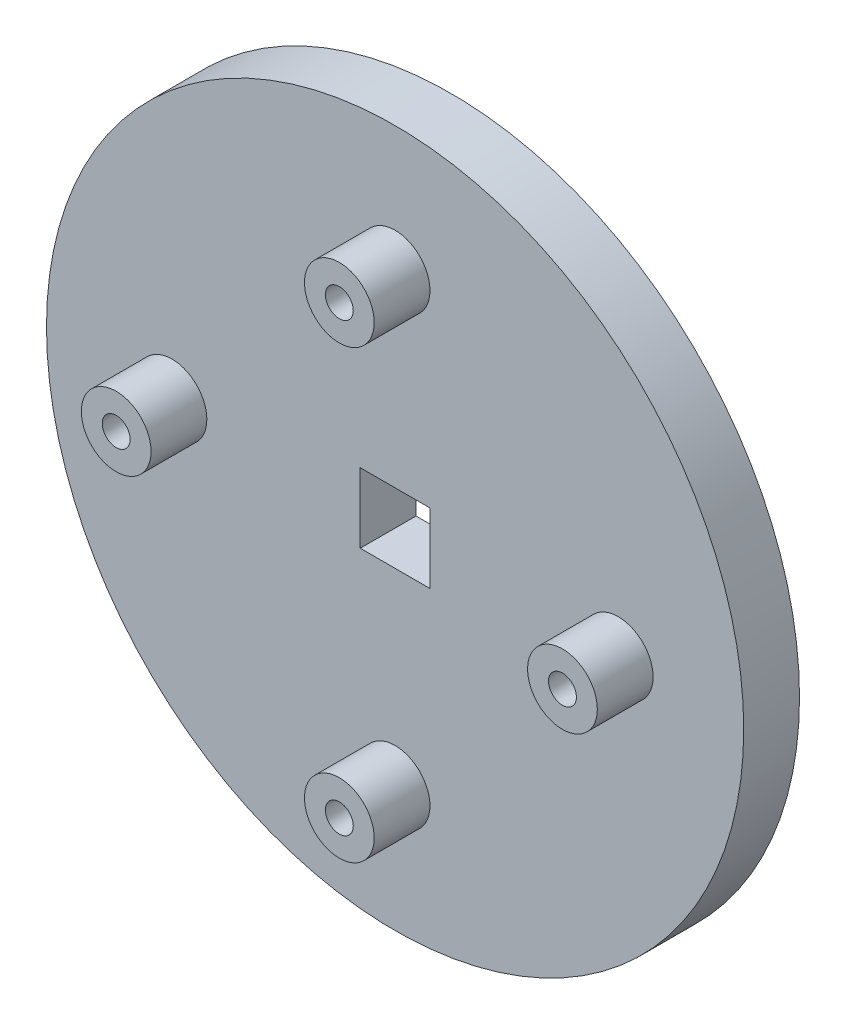
ISO-10303-21;
HEADER;
FILE_DESCRIPTION(('STEP AP214'),'2;1');
FILE_NAME('part.step','',(''),(''),'','','');
FILE_SCHEMA(('AUTOMOTIVE_DESIGN { 1 0 10303 214 1 1 1 1 }'));
ENDSEC;
DATA;
#1=APPLICATION_CONTEXT('core data for automotive mechanical design processes');
#2=APPLICATION_PROTOCOL_DEFINITION('international standard','automotive_design',2000,#1);
#3=PRODUCT_CONTEXT('',#1,'mechanical');
#4=PRODUCT('Part','Part','',(#3));
#5=PRODUCT_RELATED_PRODUCT_CATEGORY('part','',(#4));
#6=PRODUCT_DEFINITION_FORMATION('','',#4);
#7=PRODUCT_DEFINITION_CONTEXT('part definition',#1,'design');
#8=PRODUCT_DEFINITION('design','',#6,#7);
#9=PRODUCT_DEFINITION_SHAPE('','',#8);
#10=(LENGTH_UNIT() NAMED_UNIT(*) SI_UNIT(.MILLI.,.METRE.));
#11=(NAMED_UNIT(*) PLANE_ANGLE_UNIT() SI_UNIT($,.RADIAN.));
#12=(NAMED_UNIT(*) SI_UNIT($,.STERADIAN.) SOLID_ANGLE_UNIT());
#13=UNCERTAINTY_MEASURE_WITH_UNIT(LENGTH_MEASURE(1.E-05),#10,'distance_accuracy_value','');
#14=(GEOMETRIC_REPRESENTATION_CONTEXT(3) GLOBAL_UNCERTAINTY_ASSIGNED_CONTEXT((#13)) GLOBAL_UNIT_ASSIGNED_CONTEXT((#10,
#11,#12)) REPRESENTATION_CONTEXT('',''));
#15=CARTESIAN_POINT('',(0.,0.,0.));
#16=DIRECTION('',(0.,0.,1.));
#17=DIRECTION('',(1.,0.,0.));
#18=AXIS2_PLACEMENT_3D('',#15,#16,#17);
#19=CARTESIAN_POINT('',(0.,0.,8.));
#20=DIRECTION('',(0.,0.,-1.));
#21=DIRECTION('',(-1.,0.,0.));
#22=AXIS2_PLACEMENT_3D('',#19,#20,#21);
#23=CYLINDRICAL_SURFACE('',#22,50.);
#24=CARTESIAN_POINT('',(0.,0.,8.));
#25=DIRECTION('',(0.,0.,1.));
#26=DIRECTION('',(1.,0.,0.));
#27=AXIS2_PLACEMENT_3D('',#24,#25,#26);
#28=CIRCLE('',#27,50.);
#29=CARTESIAN_POINT('',(50.,0.,8.));
#30=VERTEX_POINT('',#29);
#31=EDGE_CURVE('E122',#30,#30,#28,.T.);
#32=ORIENTED_EDGE('',*,*,#31,.F.);
#33=EDGE_LOOP('',(#32));
#34=FACE_BOUND('',#33,.T.);
#35=CARTESIAN_POINT('',(0.,0.,0.));
#36=DIRECTION('',(0.,0.,1.));
#37=DIRECTION('',(1.,0.,0.));
#38=AXIS2_PLACEMENT_3D('',#35,#36,#37);
#39=CIRCLE('',#38,50.);
#40=CARTESIAN_POINT('',(50.,0.,0.));
#41=VERTEX_POINT('',#40);
#42=EDGE_CURVE('E118',#41,#41,#39,.T.);
#43=ORIENTED_EDGE('',*,*,#42,.T.);
#44=EDGE_LOOP('',(#43));
#45=FACE_BOUND('',#44,.T.);
#46=ADVANCED_FACE('F41',(#34,#45),#23,.T.);
#47=CARTESIAN_POINT('',(0.,0.,8.));
#48=DIRECTION('',(0.,0.,1.));
#49=DIRECTION('',(1.,0.,0.));
#50=AXIS2_PLACEMENT_3D('',#47,#48,#49);
#51=PLANE('',#50);
#52=CARTESIAN_POINT('',(0.,32.,8.));
#53=DIRECTION('',(0.,0.,1.));
#54=DIRECTION('',(1.,0.,0.));
#55=AXIS2_PLACEMENT_3D('',#52,#53,#54);
#56=CIRCLE('',#55,5.);
#57=CARTESIAN_POINT('',(5.,32.,8.));
#58=VERTEX_POINT('',#57);
#59=EDGE_CURVE('E231',#58,#58,#56,.T.);
#60=ORIENTED_EDGE('',*,*,#59,.F.);
#61=EDGE_LOOP('',(#60));
#62=FACE_BOUND('',#61,.T.);
#63=CARTESIAN_POINT('',(-32.,3.35182208528941E-13,8.));
#64=DIRECTION('',(0.,0.,1.));
#65=DIRECTION('',(1.,0.,0.));
#66=AXIS2_PLACEMENT_3D('',#63,#64,#65);
#67=CIRCLE('',#66,5.);
#68=CARTESIAN_POINT('',(-27.,3.35182208528941E-13,8.));
#69=VERTEX_POINT('',#68);
#70=EDGE_CURVE('E240',#69,#69,#67,.T.);
#71=ORIENTED_EDGE('',*,*,#70,.F.);
#72=EDGE_LOOP('',(#71));
#73=FACE_BOUND('',#72,.T.);
#74=CARTESIAN_POINT('',(32.,-1.1172740284298E-13,8.));
#75=DIRECTION('',(0.,0.,1.));
#76=DIRECTION('',(1.,0.,0.));
#77=AXIS2_PLACEMENT_3D('',#74,#75,#76);
#78=CIRCLE('',#77,5.);
#79=CARTESIAN_POINT('',(37.,-1.1172740284298E-13,8.));
#80=VERTEX_POINT('',#79);
#81=EDGE_CURVE('E249',#80,#80,#78,.T.);
#82=ORIENTED_EDGE('',*,*,#81,.F.);
#83=EDGE_LOOP('',(#82));
#84=FACE_BOUND('',#83,.T.);
#85=CARTESIAN_POINT('',(-2.23454805685961E-13,-32.,8.));
#86=DIRECTION('',(0.,0.,1.));
#87=DIRECTION('',(1.,0.,0.));
#88=AXIS2_PLACEMENT_3D('',#85,#86,#87);
#89=CIRCLE('',#88,5.);
#90=CARTESIAN_POINT('',(4.99999999999977,-32.,8.));
#91=VERTEX_POINT('',#90);
#92=EDGE_CURVE('E105',#91,#91,#89,.T.);
#93=ORIENTED_EDGE('',*,*,#92,.F.);
#94=EDGE_LOOP('',(#93));
#95=FACE_BOUND('',#94,.T.);
#96=DIRECTION('',(0.,1.,0.));
#97=VECTOR('',#96,1.);
#98=CARTESIAN_POINT('',(5.,-5.,8.));
#99=LINE('',#98,#97);
#100=CARTESIAN_POINT('',(5.,-5.,8.));
#101=VERTEX_POINT('',#100);
#102=CARTESIAN_POINT('',(5.,5.,8.));
#103=VERTEX_POINT('',#102);
#104=EDGE_CURVE('E55',#101,#103,#99,.T.);
#105=ORIENTED_EDGE('',*,*,#104,.F.);
#106=DIRECTION('',(1.,0.,0.));
#107=VECTOR('',#106,1.);
#108=CARTESIAN_POINT('',(-5.,-5.,8.));
#109=LINE('',#108,#107);
#110=CARTESIAN_POINT('',(-5.,-5.,8.));
#111=VERTEX_POINT('',#110);
#112=EDGE_CURVE('E99',#111,#101,#109,.T.);
#113=ORIENTED_EDGE('',*,*,#112,.F.);
#114=DIRECTION('',(0.,-1.,0.));
#115=VECTOR('',#114,1.);
#116=CARTESIAN_POINT('',(-5.,-5.,8.));
#117=LINE('',#116,#115);
#118=CARTESIAN_POINT('',(-5.,5.,8.));
#119=VERTEX_POINT('',#118);
#120=EDGE_CURVE('E102',#119,#111,#117,.T.);
#121=ORIENTED_EDGE('',*,*,#120,.F.);
#122=DIRECTION('',(-1.,0.,0.));
#123=VECTOR('',#122,1.);
#124=CARTESIAN_POINT('',(-5.,5.,8.));
#125=LINE('',#124,#123);
#126=EDGE_CURVE('E111',#103,#119,#125,.T.);
#127=ORIENTED_EDGE('',*,*,#126,.F.);
#128=EDGE_LOOP('',(#105,#113,#121,#127));
#129=FACE_BOUND('',#128,.T.);
#130=ORIENTED_EDGE('',*,*,#31,.T.);
#131=EDGE_LOOP('',(#130));
#132=FACE_BOUND('',#131,.T.);
#133=ADVANCED_FACE('F154',(#62,#73,#84,#95,#129,#132),#51,.T.);
#134=CARTESIAN_POINT('',(0.,0.,0.));
#135=DIRECTION('',(0.,0.,1.));
#136=DIRECTION('',(1.,0.,0.));
#137=AXIS2_PLACEMENT_3D('',#134,#135,#136);
#138=PLANE('',#137);
#139=DIRECTION('',(1.,0.,0.));
#140=VECTOR('',#139,1.);
#141=CARTESIAN_POINT('',(-5.,-5.,0.));
#142=LINE('',#141,#140);
#143=CARTESIAN_POINT('',(-5.,-5.,0.));
#144=VERTEX_POINT('',#143);
#145=CARTESIAN_POINT('',(5.,-5.,0.));
#146=VERTEX_POINT('',#145);
#147=EDGE_CURVE('E89',#144,#146,#142,.T.);
#148=ORIENTED_EDGE('',*,*,#147,.T.);
#149=DIRECTION('',(0.,1.,0.));
#150=VECTOR('',#149,1.);
#151=CARTESIAN_POINT('',(5.,-5.,0.));
#152=LINE('',#151,#150);
#153=CARTESIAN_POINT('',(5.,5.,0.));
#154=VERTEX_POINT('',#153);
#155=EDGE_CURVE('E83',#146,#154,#152,.T.);
#156=ORIENTED_EDGE('',*,*,#155,.T.);
#157=DIRECTION('',(-1.,0.,0.));
#158=VECTOR('',#157,1.);
#159=CARTESIAN_POINT('',(-5.,5.,0.));
#160=LINE('',#159,#158);
#161=CARTESIAN_POINT('',(-5.,5.,0.));
#162=VERTEX_POINT('',#161);
#163=EDGE_CURVE('E92',#154,#162,#160,.T.);
#164=ORIENTED_EDGE('',*,*,#163,.T.);
#165=DIRECTION('',(0.,-1.,0.));
#166=VECTOR('',#165,1.);
#167=CARTESIAN_POINT('',(-5.,-5.,0.));
#168=LINE('',#167,#166);
#169=EDGE_CURVE('E63',#162,#144,#168,.T.);
#170=ORIENTED_EDGE('',*,*,#169,.T.);
#171=EDGE_LOOP('',(#148,#156,#164,#170));
#172=FACE_BOUND('',#171,.T.);
#173=ORIENTED_EDGE('',*,*,#42,.F.);
#174=EDGE_LOOP('',(#173));
#175=FACE_BOUND('',#174,.T.);
#176=ADVANCED_FACE('F96',(#172,#175),#138,.F.);
#177=CARTESIAN_POINT('',(5.,-5.,0.));
#178=DIRECTION('',(1.,0.,0.));
#179=DIRECTION('',(0.,0.,-1.));
#180=AXIS2_PLACEMENT_3D('',#177,#178,#179);
#181=PLANE('',#180);
#182=ORIENTED_EDGE('',*,*,#104,.T.);
#183=DIRECTION('',(0.,0.,1.));
#184=VECTOR('',#183,1.);
#185=CARTESIAN_POINT('',(5.,5.,0.));
#186=LINE('',#185,#184);
#187=EDGE_CURVE('E79',#154,#103,#186,.T.);
#188=ORIENTED_EDGE('',*,*,#187,.F.);
#189=ORIENTED_EDGE('',*,*,#155,.F.);
#190=DIRECTION('',(0.,0.,1.));
#191=VECTOR('',#190,1.);
#192=CARTESIAN_POINT('',(5.,-5.,0.));
#193=LINE('',#192,#191);
#194=EDGE_CURVE('E116',#146,#101,#193,.T.);
#195=ORIENTED_EDGE('',*,*,#194,.T.);
#196=EDGE_LOOP('',(#182,#188,#189,#195));
#197=FACE_BOUND('',#196,.T.);
#198=ADVANCED_FACE('F81',(#197),#181,.F.);
#199=CARTESIAN_POINT('',(-5.,-5.,0.));
#200=DIRECTION('',(0.,-1.,0.));
#201=DIRECTION('',(0.,0.,-1.));
#202=AXIS2_PLACEMENT_3D('',#199,#200,#201);
#203=PLANE('',#202);
#204=ORIENTED_EDGE('',*,*,#112,.T.);
#205=ORIENTED_EDGE('',*,*,#194,.F.);
#206=ORIENTED_EDGE('',*,*,#147,.F.);
#207=DIRECTION('',(0.,0.,1.));
#208=VECTOR('',#207,1.);
#209=CARTESIAN_POINT('',(-5.,-5.,0.));
#210=LINE('',#209,#208);
#211=EDGE_CURVE('E119',#144,#111,#210,.T.);
#212=ORIENTED_EDGE('',*,*,#211,.T.);
#213=EDGE_LOOP('',(#204,#205,#206,#212));
#214=FACE_BOUND('',#213,.T.);
#215=ADVANCED_FACE('F176',(#214),#203,.F.);
#216=CARTESIAN_POINT('',(-5.,-5.,0.));
#217=DIRECTION('',(-1.,0.,0.));
#218=DIRECTION('',(0.,0.,1.));
#219=AXIS2_PLACEMENT_3D('',#216,#217,#218);
#220=PLANE('',#219);
#221=ORIENTED_EDGE('',*,*,#120,.T.);
#222=ORIENTED_EDGE('',*,*,#211,.F.);
#223=ORIENTED_EDGE('',*,*,#169,.F.);
#224=DIRECTION('',(0.,0.,1.));
#225=VECTOR('',#224,1.);
#226=CARTESIAN_POINT('',(-5.,5.,0.));
#227=LINE('',#226,#225);
#228=EDGE_CURVE('E88',#162,#119,#227,.T.);
#229=ORIENTED_EDGE('',*,*,#228,.T.);
#230=EDGE_LOOP('',(#221,#222,#223,#229));
#231=FACE_BOUND('',#230,.T.);
#232=ADVANCED_FACE('F180',(#231),#220,.F.);
#233=CARTESIAN_POINT('',(-5.,5.,0.));
#234=DIRECTION('',(0.,1.,0.));
#235=DIRECTION('',(0.,0.,1.));
#236=AXIS2_PLACEMENT_3D('',#233,#234,#235);
#237=PLANE('',#236);
#238=ORIENTED_EDGE('',*,*,#126,.T.);
#239=ORIENTED_EDGE('',*,*,#228,.F.);
#240=ORIENTED_EDGE('',*,*,#163,.F.);
#241=ORIENTED_EDGE('',*,*,#187,.T.);
#242=EDGE_LOOP('',(#238,#239,#240,#241));
#243=FACE_BOUND('',#242,.T.);
#244=ADVANCED_FACE('F93',(#243),#237,.F.);
#245=CARTESIAN_POINT('',(-2.23454805685961E-13,-32.,16.));
#246=DIRECTION('',(0.,0.,-1.));
#247=DIRECTION('',(-1.,0.,0.));
#248=AXIS2_PLACEMENT_3D('',#245,#246,#247);
#249=CYLINDRICAL_SURFACE('',#248,5.);
#250=CARTESIAN_POINT('',(-2.23454805685961E-13,-32.,16.));
#251=DIRECTION('',(0.,0.,1.));
#252=DIRECTION('',(1.,0.,0.));
#253=AXIS2_PLACEMENT_3D('',#250,#251,#252);
#254=CIRCLE('',#253,5.);
#255=CARTESIAN_POINT('',(4.99999999999977,-32.,16.));
#256=VERTEX_POINT('',#255);
#257=EDGE_CURVE('E255',#256,#256,#254,.T.);
#258=ORIENTED_EDGE('',*,*,#257,.F.);
#259=EDGE_LOOP('',(#258));
#260=FACE_BOUND('',#259,.T.);
#261=ORIENTED_EDGE('',*,*,#92,.T.);
#262=EDGE_LOOP('',(#261));
#263=FACE_BOUND('',#262,.T.);
#264=ADVANCED_FACE('F186',(#260,#263),#249,.T.);
#265=CARTESIAN_POINT('',(-2.23454805685961E-13,-32.,16.));
#266=DIRECTION('',(0.,0.,-1.));
#267=DIRECTION('',(-1.,0.,0.));
#268=AXIS2_PLACEMENT_3D('',#265,#266,#267);
#269=CYLINDRICAL_SURFACE('',#268,2.);
#270=CARTESIAN_POINT('',(-2.23454805685961E-13,-32.,16.));
#271=DIRECTION('',(0.,0.,1.));
#272=DIRECTION('',(1.,0.,0.));
#273=AXIS2_PLACEMENT_3D('',#270,#271,#272);
#274=CIRCLE('',#273,2.);
#275=CARTESIAN_POINT('',(1.99999999999978,-32.,16.));
#276=VERTEX_POINT('',#275);
#277=EDGE_CURVE('E254',#276,#276,#274,.T.);
#278=ORIENTED_EDGE('',*,*,#277,.T.);
#279=EDGE_LOOP('',(#278));
#280=FACE_BOUND('',#279,.T.);
#281=CARTESIAN_POINT('',(-2.23454805685961E-13,-32.,8.));
#282=DIRECTION('',(0.,0.,1.));
#283=DIRECTION('',(1.,0.,0.));
#284=AXIS2_PLACEMENT_3D('',#281,#282,#283);
#285=CIRCLE('',#284,2.);
#286=CARTESIAN_POINT('',(1.99999999999978,-32.,8.));
#287=VERTEX_POINT('',#286);
#288=EDGE_CURVE('E125',#287,#287,#285,.F.);
#289=ORIENTED_EDGE('',*,*,#288,.T.);
#290=EDGE_LOOP('',(#289));
#291=FACE_BOUND('',#290,.T.);
#292=ADVANCED_FACE('F191',(#280,#291),#269,.F.);
#293=CARTESIAN_POINT('',(0.,0.,16.));
#294=DIRECTION('',(0.,0.,1.));
#295=DIRECTION('',(1.,0.,0.));
#296=AXIS2_PLACEMENT_3D('',#293,#294,#295);
#297=PLANE('',#296);
#298=ORIENTED_EDGE('',*,*,#257,.T.);
#299=EDGE_LOOP('',(#298));
#300=FACE_BOUND('',#299,.T.);
#301=ORIENTED_EDGE('',*,*,#277,.F.);
#302=EDGE_LOOP('',(#301));
#303=FACE_BOUND('',#302,.T.);
#304=ADVANCED_FACE('F195',(#300,#303),#297,.T.);
#305=ORIENTED_EDGE('',*,*,#288,.F.);
#306=EDGE_LOOP('',(#305));
#307=FACE_BOUND('',#306,.T.);
#308=ADVANCED_FACE('F159',(#307),#51,.T.);
#309=CARTESIAN_POINT('',(32.,-1.1172740284298E-13,16.));
#310=DIRECTION('',(0.,0.,-1.));
#311=DIRECTION('',(-1.,0.,0.));
#312=AXIS2_PLACEMENT_3D('',#309,#310,#311);
#313=CYLINDRICAL_SURFACE('',#312,5.);
#314=CARTESIAN_POINT('',(32.,-1.1172740284298E-13,16.));
#315=DIRECTION('',(0.,0.,1.));
#316=DIRECTION('',(1.,0.,0.));
#317=AXIS2_PLACEMENT_3D('',#314,#315,#316);
#318=CIRCLE('',#317,5.);
#319=CARTESIAN_POINT('',(37.,-1.1172740284298E-13,16.));
#320=VERTEX_POINT('',#319);
#321=EDGE_CURVE('E246',#320,#320,#318,.T.);
#322=ORIENTED_EDGE('',*,*,#321,.F.);
#323=EDGE_LOOP('',(#322));
#324=FACE_BOUND('',#323,.T.);
#325=ORIENTED_EDGE('',*,*,#81,.T.);
#326=EDGE_LOOP('',(#325));
#327=FACE_BOUND('',#326,.T.);
#328=ADVANCED_FACE('F200',(#324,#327),#313,.T.);
#329=CARTESIAN_POINT('',(32.,-1.1172740284298E-13,16.));
#330=DIRECTION('',(0.,0.,-1.));
#331=DIRECTION('',(-1.,0.,0.));
#332=AXIS2_PLACEMENT_3D('',#329,#330,#331);
#333=CYLINDRICAL_SURFACE('',#332,2.);
#334=CARTESIAN_POINT('',(32.,-1.1172740284298E-13,16.));
#335=DIRECTION('',(0.,0.,1.));
#336=DIRECTION('',(1.,0.,0.));
#337=AXIS2_PLACEMENT_3D('',#334,#335,#336);
#338=CIRCLE('',#337,2.);
#339=CARTESIAN_POINT('',(34.,-1.1172740284298E-13,16.));
#340=VERTEX_POINT('',#339);
#341=EDGE_CURVE('E245',#340,#340,#338,.T.);
#342=ORIENTED_EDGE('',*,*,#341,.T.);
#343=EDGE_LOOP('',(#342));
#344=FACE_BOUND('',#343,.T.);
#345=CARTESIAN_POINT('',(32.,-1.1172740284298E-13,8.));
#346=DIRECTION('',(0.,0.,1.));
#347=DIRECTION('',(1.,0.,0.));
#348=AXIS2_PLACEMENT_3D('',#345,#346,#347);
#349=CIRCLE('',#348,2.);
#350=CARTESIAN_POINT('',(34.,-1.1172740284298E-13,8.));
#351=VERTEX_POINT('',#350);
#352=EDGE_CURVE('E130',#351,#351,#349,.F.);
#353=ORIENTED_EDGE('',*,*,#352,.T.);
#354=EDGE_LOOP('',(#353));
#355=FACE_BOUND('',#354,.T.);
#356=ADVANCED_FACE('F203',(#344,#355),#333,.F.);
#357=CARTESIAN_POINT('',(0.,0.,16.));
#358=DIRECTION('',(0.,0.,1.));
#359=DIRECTION('',(1.,0.,0.));
#360=AXIS2_PLACEMENT_3D('',#357,#358,#359);
#361=PLANE('',#360);
#362=ORIENTED_EDGE('',*,*,#321,.T.);
#363=EDGE_LOOP('',(#362));
#364=FACE_BOUND('',#363,.T.);
#365=ORIENTED_EDGE('',*,*,#341,.F.);
#366=EDGE_LOOP('',(#365));
#367=FACE_BOUND('',#366,.T.);
#368=ADVANCED_FACE('F157',(#364,#367),#361,.T.);
#369=ORIENTED_EDGE('',*,*,#352,.F.);
#370=EDGE_LOOP('',(#369));
#371=FACE_BOUND('',#370,.T.);
#372=ADVANCED_FACE('F142',(#371),#51,.T.);
#373=CARTESIAN_POINT('',(-32.,3.35182208528941E-13,16.));
#374=DIRECTION('',(0.,0.,-1.));
#375=DIRECTION('',(-1.,0.,0.));
#376=AXIS2_PLACEMENT_3D('',#373,#374,#375);
#377=CYLINDRICAL_SURFACE('',#376,2.);
#378=CARTESIAN_POINT('',(-32.,3.35182208528941E-13,16.));
#379=DIRECTION('',(0.,0.,1.));
#380=DIRECTION('',(1.,0.,0.));
#381=AXIS2_PLACEMENT_3D('',#378,#379,#380);
#382=CIRCLE('',#381,2.);
#383=CARTESIAN_POINT('',(-30.,3.35182208528941E-13,16.));
#384=VERTEX_POINT('',#383);
#385=EDGE_CURVE('E237',#384,#384,#382,.T.);
#386=ORIENTED_EDGE('',*,*,#385,.T.);
#387=EDGE_LOOP('',(#386));
#388=FACE_BOUND('',#387,.T.);
#389=CARTESIAN_POINT('',(-32.,3.35182208528941E-13,8.));
#390=DIRECTION('',(0.,0.,1.));
#391=DIRECTION('',(1.,0.,0.));
#392=AXIS2_PLACEMENT_3D('',#389,#390,#391);
#393=CIRCLE('',#392,2.);
#394=CARTESIAN_POINT('',(-30.,3.35182208528941E-13,8.));
#395=VERTEX_POINT('',#394);
#396=EDGE_CURVE('E48',#395,#395,#393,.F.);
#397=ORIENTED_EDGE('',*,*,#396,.T.);
#398=EDGE_LOOP('',(#397));
#399=FACE_BOUND('',#398,.T.);
#400=ADVANCED_FACE('F135',(#388,#399),#377,.F.);
#401=CARTESIAN_POINT('',(-32.,3.35182208528941E-13,16.));
#402=DIRECTION('',(0.,0.,-1.));
#403=DIRECTION('',(-1.,0.,0.));
#404=AXIS2_PLACEMENT_3D('',#401,#402,#403);
#405=CYLINDRICAL_SURFACE('',#404,5.);
#406=CARTESIAN_POINT('',(-32.,3.35182208528941E-13,16.));
#407=DIRECTION('',(0.,0.,1.));
#408=DIRECTION('',(1.,0.,0.));
#409=AXIS2_PLACEMENT_3D('',#406,#407,#408);
#410=CIRCLE('',#409,5.);
#411=CARTESIAN_POINT('',(-27.,3.35182208528941E-13,16.));
#412=VERTEX_POINT('',#411);
#413=EDGE_CURVE('E236',#412,#412,#410,.T.);
#414=ORIENTED_EDGE('',*,*,#413,.F.);
#415=EDGE_LOOP('',(#414));
#416=FACE_BOUND('',#415,.T.);
#417=ORIENTED_EDGE('',*,*,#70,.T.);
#418=EDGE_LOOP('',(#417));
#419=FACE_BOUND('',#418,.T.);
#420=ADVANCED_FACE('F151',(#416,#419),#405,.T.);
#421=CARTESIAN_POINT('',(0.,0.,16.));
#422=DIRECTION('',(0.,0.,1.));
#423=DIRECTION('',(1.,0.,0.));
#424=AXIS2_PLACEMENT_3D('',#421,#422,#423);
#425=PLANE('',#424);
#426=ORIENTED_EDGE('',*,*,#385,.F.);
#427=EDGE_LOOP('',(#426));
#428=FACE_BOUND('',#427,.T.);
#429=ORIENTED_EDGE('',*,*,#413,.T.);
#430=EDGE_LOOP('',(#429));
#431=FACE_BOUND('',#430,.T.);
#432=ADVANCED_FACE('F140',(#428,#431),#425,.T.);
#433=ORIENTED_EDGE('',*,*,#396,.F.);
#434=EDGE_LOOP('',(#433));
#435=FACE_BOUND('',#434,.T.);
#436=ADVANCED_FACE('F137',(#435),#51,.T.);
#437=CARTESIAN_POINT('',(0.,32.,16.));
#438=DIRECTION('',(0.,0.,-1.));
#439=DIRECTION('',(-1.,0.,0.));
#440=AXIS2_PLACEMENT_3D('',#437,#438,#439);
#441=CYLINDRICAL_SURFACE('',#440,2.);
#442=CARTESIAN_POINT('',(0.,32.,16.));
#443=DIRECTION('',(0.,0.,1.));
#444=DIRECTION('',(1.,0.,0.));
#445=AXIS2_PLACEMENT_3D('',#442,#443,#444);
#446=CIRCLE('',#445,2.);
#447=CARTESIAN_POINT('',(2.,32.,16.));
#448=VERTEX_POINT('',#447);
#449=EDGE_CURVE('E227',#448,#448,#446,.T.);
#450=ORIENTED_EDGE('',*,*,#449,.T.);
#451=EDGE_LOOP('',(#450));
#452=FACE_BOUND('',#451,.T.);
#453=CARTESIAN_POINT('',(0.,32.,8.));
#454=DIRECTION('',(0.,0.,1.));
#455=DIRECTION('',(1.,0.,0.));
#456=AXIS2_PLACEMENT_3D('',#453,#454,#455);
#457=CIRCLE('',#456,2.);
#458=CARTESIAN_POINT('',(2.,32.,8.));
#459=VERTEX_POINT('',#458);
#460=EDGE_CURVE('E11',#459,#459,#457,.F.);
#461=ORIENTED_EDGE('',*,*,#460,.T.);
#462=EDGE_LOOP('',(#461));
#463=FACE_BOUND('',#462,.T.);
#464=ADVANCED_FACE('F139',(#452,#463),#441,.F.);
#465=CARTESIAN_POINT('',(0.,32.,16.));
#466=DIRECTION('',(0.,0.,-1.));
#467=DIRECTION('',(-1.,0.,0.));
#468=AXIS2_PLACEMENT_3D('',#465,#466,#467);
#469=CYLINDRICAL_SURFACE('',#468,5.);
#470=CARTESIAN_POINT('',(0.,32.,16.));
#471=DIRECTION('',(0.,0.,1.));
#472=DIRECTION('',(1.,0.,0.));
#473=AXIS2_PLACEMENT_3D('',#470,#471,#472);
#474=CIRCLE('',#473,5.);
#475=CARTESIAN_POINT('',(5.,32.,16.));
#476=VERTEX_POINT('',#475);
#477=EDGE_CURVE('E112',#476,#476,#474,.T.);
#478=ORIENTED_EDGE('',*,*,#477,.F.);
#479=EDGE_LOOP('',(#478));
#480=FACE_BOUND('',#479,.T.);
#481=ORIENTED_EDGE('',*,*,#59,.T.);
#482=EDGE_LOOP('',(#481));
#483=FACE_BOUND('',#482,.T.);
#484=ADVANCED_FACE('F148',(#480,#483),#469,.T.);
#485=CARTESIAN_POINT('',(0.,0.,16.));
#486=DIRECTION('',(0.,0.,1.));
#487=DIRECTION('',(1.,0.,0.));
#488=AXIS2_PLACEMENT_3D('',#485,#486,#487);
#489=PLANE('',#488);
#490=ORIENTED_EDGE('',*,*,#449,.F.);
#491=EDGE_LOOP('',(#490));
#492=FACE_BOUND('',#491,.T.);
#493=ORIENTED_EDGE('',*,*,#477,.T.);
#494=EDGE_LOOP('',(#493));
#495=FACE_BOUND('',#494,.T.);
#496=ADVANCED_FACE('F161',(#492,#495),#489,.T.);
#497=ORIENTED_EDGE('',*,*,#460,.F.);
#498=EDGE_LOOP('',(#497));
#499=FACE_BOUND('',#498,.T.);
#500=ADVANCED_FACE('F143',(#499),#51,.T.);
#501=CLOSED_SHELL('',(#46,#133,#176,#198,#215,#232,#244,#264,#292,#304,#308,#328,#356,#368,#372,
#400,#420,#432,#436,#464,#484,#496,#500));
#502=MANIFOLD_SOLID_BREP('B2',#501);
#503=ADVANCED_BREP_SHAPE_REPRESENTATION('',(#18,#502),#14);
#504=SHAPE_DEFINITION_REPRESENTATION(#9,#503);
ENDSEC;
END-ISO-10303-21;
